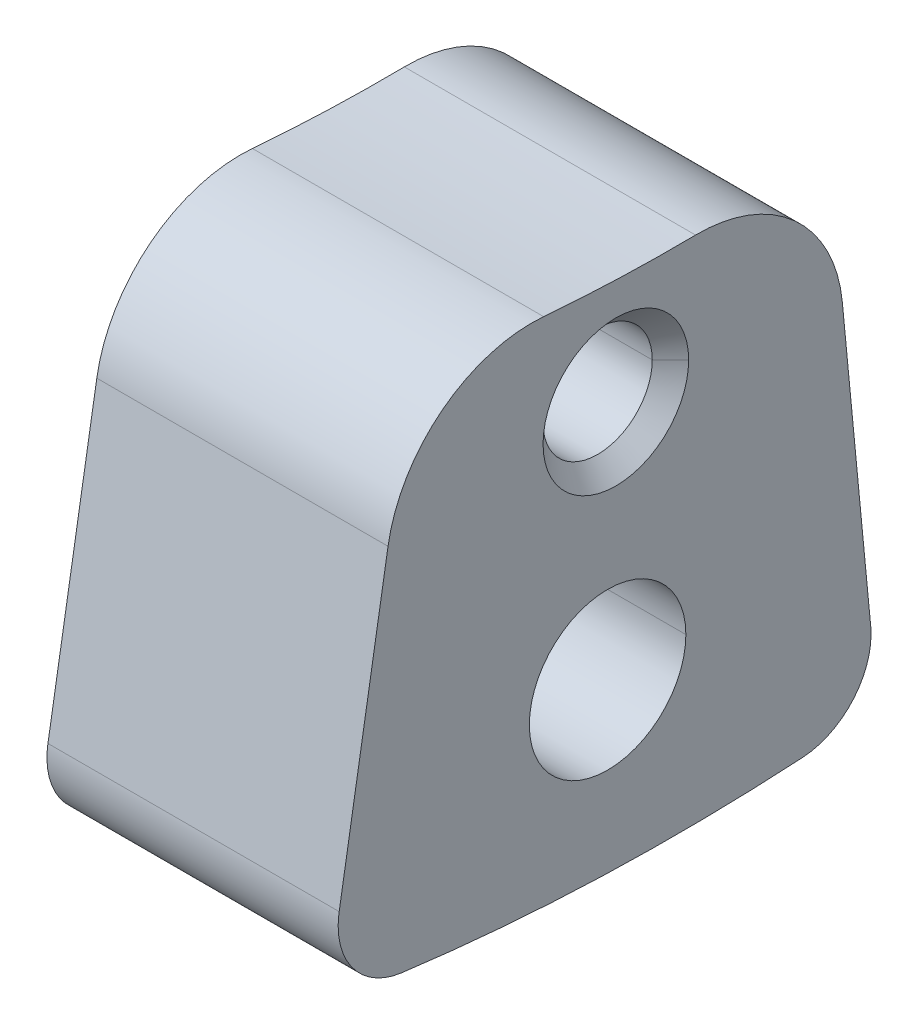
ISO-10303-21;
HEADER;
FILE_DESCRIPTION(('STEP AP214'),'2;1');
FILE_NAME('part.step','',(''),(''),'','','');
FILE_SCHEMA(('AUTOMOTIVE_DESIGN { 1 0 10303 214 1 1 1 1 }'));
ENDSEC;
DATA;
#1=APPLICATION_CONTEXT('core data for automotive mechanical design processes');
#2=APPLICATION_PROTOCOL_DEFINITION('international standard','automotive_design',2000,#1);
#3=PRODUCT_CONTEXT('',#1,'mechanical');
#4=PRODUCT('Part','Part','',(#3));
#5=PRODUCT_RELATED_PRODUCT_CATEGORY('part','',(#4));
#6=PRODUCT_DEFINITION_FORMATION('','',#4);
#7=PRODUCT_DEFINITION_CONTEXT('part definition',#1,'design');
#8=PRODUCT_DEFINITION('design','',#6,#7);
#9=PRODUCT_DEFINITION_SHAPE('','',#8);
#10=(LENGTH_UNIT() NAMED_UNIT(*) SI_UNIT(.MILLI.,.METRE.));
#11=(NAMED_UNIT(*) PLANE_ANGLE_UNIT() SI_UNIT($,.RADIAN.));
#12=(NAMED_UNIT(*) SI_UNIT($,.STERADIAN.) SOLID_ANGLE_UNIT());
#13=UNCERTAINTY_MEASURE_WITH_UNIT(LENGTH_MEASURE(1.E-05),#10,'distance_accuracy_value','');
#14=(GEOMETRIC_REPRESENTATION_CONTEXT(3) GLOBAL_UNCERTAINTY_ASSIGNED_CONTEXT((#13)) GLOBAL_UNIT_ASSIGNED_CONTEXT((#10,
#11,#12)) REPRESENTATION_CONTEXT('',''));
#15=CARTESIAN_POINT('',(0.,0.,0.));
#16=DIRECTION('',(0.,0.,1.));
#17=DIRECTION('',(1.,0.,0.));
#18=AXIS2_PLACEMENT_3D('',#15,#16,#17);
#19=CARTESIAN_POINT('',(55.1,0.,0.));
#20=DIRECTION('',(-1.,0.,0.));
#21=DIRECTION('',(0.,0.,1.));
#22=AXIS2_PLACEMENT_3D('',#19,#20,#21);
#23=PLANE('',#22);
#24=DIRECTION('',(0.,-1.,0.));
#25=VECTOR('',#24,1.);
#26=CARTESIAN_POINT('',(55.1,-46.6464746833,-60.56704418859));
#27=LINE('',#26,#25);
#28=CARTESIAN_POINT('',(55.1,-46.6464746833,-60.56704418859));
#29=VERTEX_POINT('',#28);
#30=CARTESIAN_POINT('',(55.1,-48.8464746833,-60.56704418859));
#31=VERTEX_POINT('',#30);
#32=EDGE_CURVE('E11',#29,#31,#27,.T.);
#33=ORIENTED_EDGE('',*,*,#32,.T.);
#34=DIRECTION('',(0.,0.,1.));
#35=VECTOR('',#34,1.);
#36=CARTESIAN_POINT('',(55.1,-48.8464746833,-60.56704418859));
#37=LINE('',#36,#35);
#38=CARTESIAN_POINT('',(55.1,-48.8464746833,-60.05640589199));
#39=VERTEX_POINT('',#38);
#40=EDGE_CURVE('E42',#31,#39,#37,.T.);
#41=ORIENTED_EDGE('',*,*,#40,.T.);
#42=DIRECTION('',(0.,1.,0.));
#43=VECTOR('',#42,1.);
#44=CARTESIAN_POINT('',(55.1,-48.8464746833,-60.05640589199));
#45=LINE('',#44,#43);
#46=CARTESIAN_POINT('',(55.1,-47.0964746833,-60.05640589199));
#47=VERTEX_POINT('',#46);
#48=EDGE_CURVE('E453',#39,#47,#45,.T.);
#49=ORIENTED_EDGE('',*,*,#48,.T.);
#50=DIRECTION('',(0.,0.,1.));
#51=VECTOR('',#50,1.);
#52=CARTESIAN_POINT('',(55.1,-47.0964746833,-60.05640589199));
#53=LINE('',#52,#51);
#54=CARTESIAN_POINT('',(55.1,-47.0964746833,-56.91704418859));
#55=VERTEX_POINT('',#54);
#56=EDGE_CURVE('E408',#47,#55,#53,.T.);
#57=ORIENTED_EDGE('',*,*,#56,.T.);
#58=DIRECTION('',(0.,1.,0.));
#59=VECTOR('',#58,1.);
#60=CARTESIAN_POINT('',(55.1,-47.0964746833,-56.91704418859));
#61=LINE('',#60,#59);
#62=CARTESIAN_POINT('',(55.1,-46.6464746833,-56.91704418859));
#63=VERTEX_POINT('',#62);
#64=EDGE_CURVE('E399',#55,#63,#61,.T.);
#65=ORIENTED_EDGE('',*,*,#64,.T.);
#66=DIRECTION('',(0.,0.,-1.));
#67=VECTOR('',#66,1.);
#68=CARTESIAN_POINT('',(55.1,-46.6464746833,-56.91704418859));
#69=LINE('',#68,#67);
#70=EDGE_CURVE('E278',#63,#29,#69,.T.);
#71=ORIENTED_EDGE('',*,*,#70,.T.);
#72=EDGE_LOOP('',(#33,#41,#49,#57,#65,#71));
#73=FACE_BOUND('',#72,.T.);
#74=ADVANCED_FACE('F17',(#73),#23,.T.);
#75=CARTESIAN_POINT('',(55.,-46.6464746833,-60.56704418859));
#76=DIRECTION('',(0.,0.,-1.));
#77=DIRECTION('',(0.,-1.,0.));
#78=AXIS2_PLACEMENT_3D('',#75,#76,#77);
#79=PLANE('',#78);
#80=DIRECTION('',(1.,0.,0.));
#81=VECTOR('',#80,1.);
#82=CARTESIAN_POINT('',(55.,-48.8464746833,-60.56704418859));
#83=LINE('',#82,#81);
#84=CARTESIAN_POINT('',(55.,-48.8464746833,-60.56704418859));
#85=VERTEX_POINT('',#84);
#86=EDGE_CURVE('E25',#85,#31,#83,.T.);
#87=ORIENTED_EDGE('',*,*,#86,.T.);
#88=ORIENTED_EDGE('',*,*,#32,.F.);
#89=DIRECTION('',(1.,0.,0.));
#90=VECTOR('',#89,1.);
#91=CARTESIAN_POINT('',(55.,-46.6464746833,-60.56704418859));
#92=LINE('',#91,#90);
#93=CARTESIAN_POINT('',(55.,-46.6464746833,-60.56704418859));
#94=VERTEX_POINT('',#93);
#95=EDGE_CURVE('E274',#94,#29,#92,.T.);
#96=ORIENTED_EDGE('',*,*,#95,.F.);
#97=DIRECTION('',(0.,-1.,0.));
#98=VECTOR('',#97,1.);
#99=CARTESIAN_POINT('',(55.,-46.6464746833,-60.56704418859));
#100=LINE('',#99,#98);
#101=EDGE_CURVE('E328',#94,#85,#100,.T.);
#102=ORIENTED_EDGE('',*,*,#101,.T.);
#103=EDGE_LOOP('',(#87,#88,#96,#102));
#104=FACE_BOUND('',#103,.T.);
#105=ADVANCED_FACE('F680',(#104),#79,.F.);
#106=CARTESIAN_POINT('',(55.,-48.8464746833,-60.56704418859));
#107=DIRECTION('',(0.,-1.,0.));
#108=DIRECTION('',(0.,0.,-1.));
#109=AXIS2_PLACEMENT_3D('',#106,#107,#108);
#110=PLANE('',#109);
#111=DIRECTION('',(1.,0.,0.));
#112=VECTOR('',#111,1.);
#113=CARTESIAN_POINT('',(55.,-48.8464746833,-60.05640589199));
#114=LINE('',#113,#112);
#115=CARTESIAN_POINT('',(55.,-48.8464746833,-60.05640589199));
#116=VERTEX_POINT('',#115);
#117=EDGE_CURVE('E479',#116,#39,#114,.T.);
#118=ORIENTED_EDGE('',*,*,#117,.T.);
#119=ORIENTED_EDGE('',*,*,#40,.F.);
#120=ORIENTED_EDGE('',*,*,#86,.F.);
#121=DIRECTION('',(0.,0.,1.));
#122=VECTOR('',#121,1.);
#123=CARTESIAN_POINT('',(55.,-48.8464746833,-60.56704418859));
#124=LINE('',#123,#122);
#125=EDGE_CURVE('E324',#85,#116,#124,.T.);
#126=ORIENTED_EDGE('',*,*,#125,.T.);
#127=EDGE_LOOP('',(#118,#119,#120,#126));
#128=FACE_BOUND('',#127,.T.);
#129=ADVANCED_FACE('F684',(#128),#110,.F.);
#130=CARTESIAN_POINT('',(55.,-49.3464746833,-60.05640589199));
#131=DIRECTION('',(0.,0.,1.));
#132=DIRECTION('',(1.,0.,0.));
#133=AXIS2_PLACEMENT_3D('',#130,#131,#132);
#134=PLANE('',#133);
#135=DIRECTION('',(1.,0.,0.));
#136=VECTOR('',#135,1.);
#137=CARTESIAN_POINT('',(55.,-47.0964746833,-60.05640589199));
#138=LINE('',#137,#136);
#139=CARTESIAN_POINT('',(55.,-47.0964746833,-60.05640589199));
#140=VERTEX_POINT('',#139);
#141=EDGE_CURVE('E411',#140,#47,#138,.T.);
#142=ORIENTED_EDGE('',*,*,#141,.T.);
#143=ORIENTED_EDGE('',*,*,#48,.F.);
#144=ORIENTED_EDGE('',*,*,#117,.F.);
#145=DIRECTION('',(0.,1.,0.));
#146=VECTOR('',#145,1.);
#147=CARTESIAN_POINT('',(55.,-48.8464746833,-60.05640589199));
#148=LINE('',#147,#146);
#149=EDGE_CURVE('E320',#116,#140,#148,.T.);
#150=ORIENTED_EDGE('',*,*,#149,.T.);
#151=EDGE_LOOP('',(#142,#143,#144,#150));
#152=FACE_BOUND('',#151,.T.);
#153=ADVANCED_FACE('F689',(#152),#134,.F.);
#154=CARTESIAN_POINT('',(55.,-47.0964746833,-60.05640589199));
#155=DIRECTION('',(0.,-1.,0.));
#156=DIRECTION('',(0.,0.,-1.));
#157=AXIS2_PLACEMENT_3D('',#154,#155,#156);
#158=PLANE('',#157);
#159=DIRECTION('',(1.,0.,0.));
#160=VECTOR('',#159,1.);
#161=CARTESIAN_POINT('',(55.,-47.0964746833,-56.91704418859));
#162=LINE('',#161,#160);
#163=CARTESIAN_POINT('',(55.,-47.0964746833,-56.91704418859));
#164=VERTEX_POINT('',#163);
#165=EDGE_CURVE('E412',#164,#55,#162,.T.);
#166=ORIENTED_EDGE('',*,*,#165,.T.);
#167=ORIENTED_EDGE('',*,*,#56,.F.);
#168=ORIENTED_EDGE('',*,*,#141,.F.);
#169=DIRECTION('',(0.,0.,1.));
#170=VECTOR('',#169,1.);
#171=CARTESIAN_POINT('',(55.,-47.0964746833,-60.05640589199));
#172=LINE('',#171,#170);
#173=EDGE_CURVE('E319',#140,#164,#172,.T.);
#174=ORIENTED_EDGE('',*,*,#173,.T.);
#175=EDGE_LOOP('',(#166,#167,#168,#174));
#176=FACE_BOUND('',#175,.T.);
#177=ADVANCED_FACE('F695',(#176),#158,.F.);
#178=CARTESIAN_POINT('',(55.,-47.0964746833,-56.91704418859));
#179=DIRECTION('',(0.,0.,1.));
#180=DIRECTION('',(1.,0.,0.));
#181=AXIS2_PLACEMENT_3D('',#178,#179,#180);
#182=PLANE('',#181);
#183=DIRECTION('',(1.,0.,0.));
#184=VECTOR('',#183,1.);
#185=CARTESIAN_POINT('',(55.,-46.6464746833,-56.91704418859));
#186=LINE('',#185,#184);
#187=CARTESIAN_POINT('',(55.,-46.6464746833,-56.91704418859));
#188=VERTEX_POINT('',#187);
#189=EDGE_CURVE('E395',#188,#63,#186,.T.);
#190=ORIENTED_EDGE('',*,*,#189,.T.);
#191=ORIENTED_EDGE('',*,*,#64,.F.);
#192=ORIENTED_EDGE('',*,*,#165,.F.);
#193=DIRECTION('',(0.,1.,0.));
#194=VECTOR('',#193,1.);
#195=CARTESIAN_POINT('',(55.,-47.0964746833,-56.91704418859));
#196=LINE('',#195,#194);
#197=EDGE_CURVE('E302',#164,#188,#196,.T.);
#198=ORIENTED_EDGE('',*,*,#197,.T.);
#199=EDGE_LOOP('',(#190,#191,#192,#198));
#200=FACE_BOUND('',#199,.T.);
#201=ADVANCED_FACE('F699',(#200),#182,.F.);
#202=CARTESIAN_POINT('',(55.,-46.6464746833,-56.56704418859));
#203=DIRECTION('',(0.,1.,0.));
#204=DIRECTION('',(1.,0.,0.));
#205=AXIS2_PLACEMENT_3D('',#202,#203,#204);
#206=PLANE('',#205);
#207=ORIENTED_EDGE('',*,*,#95,.T.);
#208=ORIENTED_EDGE('',*,*,#70,.F.);
#209=ORIENTED_EDGE('',*,*,#189,.F.);
#210=DIRECTION('',(0.,0.,-1.));
#211=VECTOR('',#210,1.);
#212=CARTESIAN_POINT('',(55.,-46.6464746833,-56.91704418859));
#213=LINE('',#212,#211);
#214=EDGE_CURVE('E332',#188,#94,#213,.T.);
#215=ORIENTED_EDGE('',*,*,#214,.T.);
#216=EDGE_LOOP('',(#207,#208,#209,#215));
#217=FACE_BOUND('',#216,.T.);
#218=ADVANCED_FACE('F703',(#217),#206,.F.);
#219=CARTESIAN_POINT('',(55.,-46.8714297872,-62.36321360465));
#220=DIRECTION('',(1.,0.,0.));
#221=DIRECTION('',(0.,0.,-1.));
#222=AXIS2_PLACEMENT_3D('',#219,#220,#221);
#223=CYLINDRICAL_SURFACE('',#222,1.5);
#224=DIRECTION('',(-1.,-1.333470815331E-10,6.144489362137E-11));
#225=VECTOR('',#224,1.);
#226=CARTESIAN_POINT('',(62.49999999954,-46.8714297862,-60.86321360511));
#227=LINE('',#226,#225);
#228=CARTESIAN_POINT('',(62.5,-46.8714297872,-60.86321360465));
#229=VERTEX_POINT('',#228);
#230=CARTESIAN_POINT('',(55.,-46.8714297872,-60.86321360465));
#231=VERTEX_POINT('',#230);
#232=EDGE_CURVE('E279',#229,#231,#227,.T.);
#233=ORIENTED_EDGE('',*,*,#232,.T.);
#234=CARTESIAN_POINT('',(55.,-46.8714297872,-62.36321360465));
#235=DIRECTION('',(-1.,0.,0.));
#236=DIRECTION('',(0.,0.,1.));
#237=AXIS2_PLACEMENT_3D('',#234,#235,#236);
#238=CIRCLE('',#237,1.5);
#239=CARTESIAN_POINT('',(55.,-46.8714297872,-63.86321360465));
#240=VERTEX_POINT('',#239);
#241=EDGE_CURVE('E298',#231,#240,#238,.T.);
#242=ORIENTED_EDGE('',*,*,#241,.T.);
#243=DIRECTION('',(-1.,1.333508710944E-10,-6.144394623105E-11));
#244=VECTOR('',#243,1.);
#245=CARTESIAN_POINT('',(62.49999999954,-46.8714297882,-63.86321360419));
#246=LINE('',#245,#244);
#247=CARTESIAN_POINT('',(62.5,-46.8714297872,-63.86321360465));
#248=VERTEX_POINT('',#247);
#249=EDGE_CURVE('E463',#248,#240,#246,.T.);
#250=ORIENTED_EDGE('',*,*,#249,.F.);
#251=CARTESIAN_POINT('',(62.5,-46.8714297872,-62.36321360465));
#252=DIRECTION('',(-1.,0.,0.));
#253=DIRECTION('',(0.,0.,1.));
#254=AXIS2_PLACEMENT_3D('',#251,#252,#253);
#255=CIRCLE('',#254,1.5);
#256=EDGE_CURVE('E351',#229,#248,#255,.T.);
#257=ORIENTED_EDGE('',*,*,#256,.F.);
#258=EDGE_LOOP('',(#233,#242,#250,#257));
#259=FACE_BOUND('',#258,.T.);
#260=ADVANCED_FACE('F707',(#259),#223,.F.);
#261=CARTESIAN_POINT('',(55.,-46.8714297872,-62.36321360465));
#262=DIRECTION('',(1.,0.,0.));
#263=DIRECTION('',(0.,0.,-1.));
#264=AXIS2_PLACEMENT_3D('',#261,#262,#263);
#265=CYLINDRICAL_SURFACE('',#264,1.5);
#266=ORIENTED_EDGE('',*,*,#249,.T.);
#267=CARTESIAN_POINT('',(55.,-46.8714297872,-62.36321360465));
#268=DIRECTION('',(-1.,0.,0.));
#269=DIRECTION('',(0.,0.,-1.));
#270=AXIS2_PLACEMENT_3D('',#267,#268,#269);
#271=CIRCLE('',#270,1.5);
#272=EDGE_CURVE('E303',#240,#231,#271,.T.);
#273=ORIENTED_EDGE('',*,*,#272,.T.);
#274=ORIENTED_EDGE('',*,*,#232,.F.);
#275=CARTESIAN_POINT('',(62.5,-46.8714297872,-62.36321360465));
#276=DIRECTION('',(-1.,0.,0.));
#277=DIRECTION('',(0.,0.,-1.));
#278=AXIS2_PLACEMENT_3D('',#275,#276,#277);
#279=CIRCLE('',#278,1.5);
#280=EDGE_CURVE('E350',#248,#229,#279,.T.);
#281=ORIENTED_EDGE('',*,*,#280,.F.);
#282=EDGE_LOOP('',(#266,#273,#274,#281));
#283=FACE_BOUND('',#282,.T.);
#284=ADVANCED_FACE('F711',(#283),#265,.F.);
#285=CARTESIAN_POINT('',(62.74999999951,-46.8714297872,-62.36321360465));
#286=DIRECTION('',(1.,0.,0.));
#287=DIRECTION('',(0.,0.,-1.));
#288=AXIS2_PLACEMENT_3D('',#285,#286,#287);
#289=CONICAL_SURFACE('',#288,1.749999999507,0.7853981633973);
#290=DIRECTION('',(-0.707106781186548,1.10005953244907E-09,0.707106781186548));
#291=VECTOR('',#290,1.);
#292=CARTESIAN_POINT('',(62.99999999918,-46.87142978898,-64.36321360383));
#293=LINE('',#292,#291);
#294=CARTESIAN_POINT('',(63.,-46.8714297872,-64.36321360465));
#295=VERTEX_POINT('',#294);
#296=EDGE_CURVE('E346',#295,#248,#293,.T.);
#297=ORIENTED_EDGE('',*,*,#296,.T.);
#298=ORIENTED_EDGE('',*,*,#280,.T.);
#299=DIRECTION('',(-0.707106781186498,-1.100069581041E-09,-0.707106781186597));
#300=VECTOR('',#299,1.);
#301=CARTESIAN_POINT('',(62.99999999918,-46.87142978542,-60.36321360547));
#302=LINE('',#301,#300);
#303=CARTESIAN_POINT('',(63.,-46.8714297872,-60.36321360465));
#304=VERTEX_POINT('',#303);
#305=EDGE_CURVE('E449',#304,#229,#302,.T.);
#306=ORIENTED_EDGE('',*,*,#305,.F.);
#307=CARTESIAN_POINT('',(63.,-46.8714297872,-62.36321360465));
#308=DIRECTION('',(-1.,0.,0.));
#309=DIRECTION('',(0.,0.,-1.));
#310=AXIS2_PLACEMENT_3D('',#307,#308,#309);
#311=CIRCLE('',#310,2.);
#312=EDGE_CURVE('E383',#295,#304,#311,.T.);
#313=ORIENTED_EDGE('',*,*,#312,.F.);
#314=EDGE_LOOP('',(#297,#298,#306,#313));
#315=FACE_BOUND('',#314,.T.);
#316=ADVANCED_FACE('F715',(#315),#289,.F.);
#317=CARTESIAN_POINT('',(62.74999999951,-46.8714297872,-62.36321360465));
#318=DIRECTION('',(1.,0.,0.));
#319=DIRECTION('',(0.,0.,-1.));
#320=AXIS2_PLACEMENT_3D('',#317,#318,#319);
#321=CONICAL_SURFACE('',#320,1.749999999507,0.7853981633973);
#322=ORIENTED_EDGE('',*,*,#305,.T.);
#323=ORIENTED_EDGE('',*,*,#256,.T.);
#324=ORIENTED_EDGE('',*,*,#296,.F.);
#325=CARTESIAN_POINT('',(63.,-46.8714297872,-62.36321360465));
#326=DIRECTION('',(-1.,0.,0.));
#327=DIRECTION('',(0.,0.,1.));
#328=AXIS2_PLACEMENT_3D('',#325,#326,#327);
#329=CIRCLE('',#328,2.);
#330=EDGE_CURVE('E394',#304,#295,#329,.T.);
#331=ORIENTED_EDGE('',*,*,#330,.F.);
#332=EDGE_LOOP('',(#322,#323,#324,#331));
#333=FACE_BOUND('',#332,.T.);
#334=ADVANCED_FACE('F719',(#333),#321,.F.);
#335=CARTESIAN_POINT('',(55.,-53.36747016282,-62.13636687609));
#336=DIRECTION('',(1.,0.,0.));
#337=DIRECTION('',(0.,0.,-1.));
#338=AXIS2_PLACEMENT_3D('',#335,#336,#337);
#339=CYLINDRICAL_SURFACE('',#338,2.15);
#340=DIRECTION('',(-1.,2.037552349241E-10,8.587010468503E-11));
#341=VECTOR('',#340,1.);
#342=CARTESIAN_POINT('',(63.,-53.36747016282,-64.28636687609));
#343=LINE('',#342,#341);
#344=CARTESIAN_POINT('',(63.,-53.36747016282,-64.28636687609));
#345=VERTEX_POINT('',#344);
#346=CARTESIAN_POINT('',(59.5,-53.36747016282,-64.28636687609));
#347=VERTEX_POINT('',#346);
#348=EDGE_CURVE('E284',#345,#347,#343,.T.);
#349=ORIENTED_EDGE('',*,*,#348,.F.);
#350=CARTESIAN_POINT('',(63.,-53.36747016282,-62.13636687609));
#351=DIRECTION('',(1.,0.,0.));
#352=DIRECTION('',(0.,0.,-1.));
#353=AXIS2_PLACEMENT_3D('',#350,#351,#352);
#354=CIRCLE('',#353,2.15);
#355=CARTESIAN_POINT('',(63.,-53.36747016282,-59.98636687609));
#356=VERTEX_POINT('',#355);
#357=EDGE_CURVE('E384',#345,#356,#354,.T.);
#358=ORIENTED_EDGE('',*,*,#357,.T.);
#359=DIRECTION('',(-1.,-2.037592951683E-10,-8.586807456293E-11));
#360=VECTOR('',#359,1.);
#361=CARTESIAN_POINT('',(63.,-53.36747016282,-59.98636687609));
#362=LINE('',#361,#360);
#363=CARTESIAN_POINT('',(59.5,-53.36747016282,-59.98636687609));
#364=VERTEX_POINT('',#363);
#365=EDGE_CURVE('E280',#356,#364,#362,.T.);
#366=ORIENTED_EDGE('',*,*,#365,.T.);
#367=CARTESIAN_POINT('',(59.5,-53.36747016282,-62.13636687609));
#368=DIRECTION('',(1.,0.,0.));
#369=DIRECTION('',(0.,0.,-1.));
#370=AXIS2_PLACEMENT_3D('',#367,#368,#369);
#371=CIRCLE('',#370,2.15);
#372=EDGE_CURVE('E446',#347,#364,#371,.T.);
#373=ORIENTED_EDGE('',*,*,#372,.F.);
#374=EDGE_LOOP('',(#349,#358,#366,#373));
#375=FACE_BOUND('',#374,.T.);
#376=ADVANCED_FACE('F723',(#375),#339,.F.);
#377=CARTESIAN_POINT('',(59.25000000038,-53.36747016282,-62.13636687609));
#378=DIRECTION('',(-1.,0.,0.));
#379=DIRECTION('',(0.,0.,-1.));
#380=AXIS2_PLACEMENT_3D('',#377,#378,#379);
#381=CONICAL_SURFACE('',#380,2.399999999621,0.7853981633973);
#382=DIRECTION('',(0.707106781186597,-6.48897860167498E-10,0.707106781186498));
#383=VECTOR('',#382,1.);
#384=CARTESIAN_POINT('',(59.00000000049,-53.36747016165,-64.7863668756));
#385=LINE('',#384,#383);
#386=CARTESIAN_POINT('',(59.,-53.36747016282,-64.78636687609));
#387=VERTEX_POINT('',#386);
#388=EDGE_CURVE('E426',#387,#347,#385,.T.);
#389=ORIENTED_EDGE('',*,*,#388,.T.);
#390=ORIENTED_EDGE('',*,*,#372,.T.);
#391=DIRECTION('',(0.707106781186548,6.48917957351044E-10,-0.707106781186548));
#392=VECTOR('',#391,1.);
#393=CARTESIAN_POINT('',(59.00000000049,-53.36747016399,-59.48636687658));
#394=LINE('',#393,#392);
#395=CARTESIAN_POINT('',(59.,-53.36747016282,-59.48636687609));
#396=VERTEX_POINT('',#395);
#397=EDGE_CURVE('E422',#396,#364,#394,.T.);
#398=ORIENTED_EDGE('',*,*,#397,.F.);
#399=CARTESIAN_POINT('',(59.,-53.36747016282,-62.13636687609));
#400=DIRECTION('',(1.,0.,0.));
#401=DIRECTION('',(0.,0.,-1.));
#402=AXIS2_PLACEMENT_3D('',#399,#400,#401);
#403=CIRCLE('',#402,2.65);
#404=EDGE_CURVE('E315',#387,#396,#403,.T.);
#405=ORIENTED_EDGE('',*,*,#404,.F.);
#406=EDGE_LOOP('',(#389,#390,#398,#405));
#407=FACE_BOUND('',#406,.T.);
#408=ADVANCED_FACE('F727',(#407),#381,.F.);
#409=CARTESIAN_POINT('',(55.,-53.36747016282,-62.13636687609));
#410=DIRECTION('',(1.,0.,0.));
#411=DIRECTION('',(0.,0.,-1.));
#412=AXIS2_PLACEMENT_3D('',#409,#410,#411);
#413=CYLINDRICAL_SURFACE('',#412,4.125);
#414=DIRECTION('',(-1.,0.,0.));
#415=VECTOR('',#414,1.);
#416=CARTESIAN_POINT('',(59.,-53.36747016282,-58.01136687609));
#417=LINE('',#416,#415);
#418=CARTESIAN_POINT('',(59.,-53.36747016282,-58.01136687609));
#419=VERTEX_POINT('',#418);
#420=CARTESIAN_POINT('',(55.,-53.36747016282,-58.01136687609));
#421=VERTEX_POINT('',#420);
#422=EDGE_CURVE('E314',#419,#421,#417,.T.);
#423=ORIENTED_EDGE('',*,*,#422,.T.);
#424=CARTESIAN_POINT('',(55.,-53.36747016282,-62.13636687609));
#425=DIRECTION('',(-1.,0.,0.));
#426=DIRECTION('',(0.,0.,1.));
#427=AXIS2_PLACEMENT_3D('',#424,#425,#426);
#428=CIRCLE('',#427,4.125);
#429=CARTESIAN_POINT('',(55.,-53.36747016282,-66.26136687609));
#430=VERTEX_POINT('',#429);
#431=EDGE_CURVE('E307',#421,#430,#428,.T.);
#432=ORIENTED_EDGE('',*,*,#431,.T.);
#433=DIRECTION('',(-1.,0.,0.));
#434=VECTOR('',#433,1.);
#435=CARTESIAN_POINT('',(59.,-53.36747016282,-66.26136687609));
#436=LINE('',#435,#434);
#437=CARTESIAN_POINT('',(59.,-53.36747016282,-66.26136687609));
#438=VERTEX_POINT('',#437);
#439=EDGE_CURVE('E311',#438,#430,#436,.T.);
#440=ORIENTED_EDGE('',*,*,#439,.F.);
#441=CARTESIAN_POINT('',(59.,-53.36747016282,-62.13636687609));
#442=DIRECTION('',(1.,0.,0.));
#443=DIRECTION('',(0.,0.,-1.));
#444=AXIS2_PLACEMENT_3D('',#441,#442,#443);
#445=CIRCLE('',#444,4.125);
#446=EDGE_CURVE('E434',#438,#419,#445,.T.);
#447=ORIENTED_EDGE('',*,*,#446,.T.);
#448=EDGE_LOOP('',(#423,#432,#440,#447));
#449=FACE_BOUND('',#448,.T.);
#450=ADVANCED_FACE('F731',(#449),#413,.F.);
#451=CARTESIAN_POINT('',(55.,-53.36747016282,-62.13636687609));
#452=DIRECTION('',(1.,0.,0.));
#453=DIRECTION('',(0.,0.,-1.));
#454=AXIS2_PLACEMENT_3D('',#451,#452,#453);
#455=CYLINDRICAL_SURFACE('',#454,4.125);
#456=ORIENTED_EDGE('',*,*,#439,.T.);
#457=CARTESIAN_POINT('',(55.,-53.36747016282,-62.13636687609));
#458=DIRECTION('',(-1.,0.,0.));
#459=DIRECTION('',(0.,0.,-1.));
#460=AXIS2_PLACEMENT_3D('',#457,#458,#459);
#461=CIRCLE('',#460,4.125);
#462=EDGE_CURVE('E297',#430,#421,#461,.T.);
#463=ORIENTED_EDGE('',*,*,#462,.T.);
#464=ORIENTED_EDGE('',*,*,#422,.F.);
#465=CARTESIAN_POINT('',(59.,-53.36747016282,-62.13636687609));
#466=DIRECTION('',(1.,0.,0.));
#467=DIRECTION('',(0.,0.,1.));
#468=AXIS2_PLACEMENT_3D('',#465,#466,#467);
#469=CIRCLE('',#468,4.125);
#470=EDGE_CURVE('E438',#419,#438,#469,.T.);
#471=ORIENTED_EDGE('',*,*,#470,.T.);
#472=EDGE_LOOP('',(#456,#463,#464,#471));
#473=FACE_BOUND('',#472,.T.);
#474=ADVANCED_FACE('F737',(#473),#455,.F.);
#475=CARTESIAN_POINT('',(59.,-49.24247016282,-62.13636687609));
#476=DIRECTION('',(-1.,0.,0.));
#477=DIRECTION('',(0.,0.,1.));
#478=AXIS2_PLACEMENT_3D('',#475,#476,#477);
#479=PLANE('',#478);
#480=ORIENTED_EDGE('',*,*,#404,.T.);
#481=CARTESIAN_POINT('',(59.,-53.36747016282,-62.13636687609));
#482=DIRECTION('',(1.,0.,0.));
#483=DIRECTION('',(0.,0.,1.));
#484=AXIS2_PLACEMENT_3D('',#481,#482,#483);
#485=CIRCLE('',#484,2.65);
#486=EDGE_CURVE('E430',#396,#387,#485,.T.);
#487=ORIENTED_EDGE('',*,*,#486,.T.);
#488=EDGE_LOOP('',(#480,#487));
#489=FACE_BOUND('',#488,.T.);
#490=ORIENTED_EDGE('',*,*,#446,.F.);
#491=ORIENTED_EDGE('',*,*,#470,.F.);
#492=EDGE_LOOP('',(#490,#491));
#493=FACE_BOUND('',#492,.T.);
#494=ADVANCED_FACE('F733',(#489,#493),#479,.T.);
#495=CARTESIAN_POINT('',(59.25000000038,-53.36747016282,-62.13636687609));
#496=DIRECTION('',(-1.,0.,0.));
#497=DIRECTION('',(0.,0.,-1.));
#498=AXIS2_PLACEMENT_3D('',#495,#496,#497);
#499=CONICAL_SURFACE('',#498,2.399999999621,0.7853981633973);
#500=ORIENTED_EDGE('',*,*,#397,.T.);
#501=CARTESIAN_POINT('',(59.5,-53.36747016282,-62.13636687609));
#502=DIRECTION('',(1.,0.,0.));
#503=DIRECTION('',(0.,0.,1.));
#504=AXIS2_PLACEMENT_3D('',#501,#502,#503);
#505=CIRCLE('',#504,2.15);
#506=EDGE_CURVE('E418',#364,#347,#505,.T.);
#507=ORIENTED_EDGE('',*,*,#506,.T.);
#508=ORIENTED_EDGE('',*,*,#388,.F.);
#509=ORIENTED_EDGE('',*,*,#486,.F.);
#510=EDGE_LOOP('',(#500,#507,#508,#509));
#511=FACE_BOUND('',#510,.T.);
#512=ADVANCED_FACE('F736',(#511),#499,.F.);
#513=CARTESIAN_POINT('',(55.,-53.36747016282,-62.13636687609));
#514=DIRECTION('',(1.,0.,0.));
#515=DIRECTION('',(0.,0.,-1.));
#516=AXIS2_PLACEMENT_3D('',#513,#514,#515);
#517=CYLINDRICAL_SURFACE('',#516,2.15);
#518=ORIENTED_EDGE('',*,*,#365,.F.);
#519=CARTESIAN_POINT('',(63.,-53.36747016282,-62.13636687609));
#520=DIRECTION('',(1.,0.,0.));
#521=DIRECTION('',(0.,0.,1.));
#522=AXIS2_PLACEMENT_3D('',#519,#520,#521);
#523=CIRCLE('',#522,2.15);
#524=EDGE_CURVE('E379',#356,#345,#523,.T.);
#525=ORIENTED_EDGE('',*,*,#524,.T.);
#526=ORIENTED_EDGE('',*,*,#348,.T.);
#527=ORIENTED_EDGE('',*,*,#506,.F.);
#528=EDGE_LOOP('',(#518,#525,#526,#527));
#529=FACE_BOUND('',#528,.T.);
#530=ADVANCED_FACE('F744',(#529),#517,.F.);
#531=CARTESIAN_POINT('',(-1057.368264902,-47.99621214115,-64.60300920555));
#532=DIRECTION('',(1.,0.,0.));
#533=DIRECTION('',(0.,0.,-1.));
#534=AXIS2_PLACEMENT_3D('',#531,#532,#533);
#535=CYLINDRICAL_SURFACE('',#534,4.);
#536=DIRECTION('',(-1.,0.,3.517186542012E-13));
#537=VECTOR('',#536,1.);
#538=CARTESIAN_POINT('',(63.,-43.99652779605,-64.5527584384));
#539=LINE('',#538,#537);
#540=CARTESIAN_POINT('',(63.,-43.99652779605,-64.55275843837));
#541=VERTEX_POINT('',#540);
#542=CARTESIAN_POINT('',(55.,-43.99652779605,-64.55275843836));
#543=VERTEX_POINT('',#542);
#544=EDGE_CURVE('E339',#541,#543,#539,.T.);
#545=ORIENTED_EDGE('',*,*,#544,.F.);
#546=CARTESIAN_POINT('',(63.,-47.99621214115,-64.60300920555));
#547=DIRECTION('',(-1.,0.,0.));
#548=DIRECTION('',(0.,0.99992108627374,0.0125626917953105));
#549=AXIS2_PLACEMENT_3D('',#546,#547,#548);
#550=CIRCLE('',#549,4.);
#551=CARTESIAN_POINT('',(63.,-47.61282913109,-68.58459399902));
#552=VERTEX_POINT('',#551);
#553=EDGE_CURVE('E352',#541,#552,#550,.T.);
#554=ORIENTED_EDGE('',*,*,#553,.T.);
#555=DIRECTION('',(1.,-2.343014671169E-12,-4.032330025439E-13));
#556=VECTOR('',#555,1.);
#557=CARTESIAN_POINT('',(55.,-47.61282913108,-68.58459399902));
#558=LINE('',#557,#556);
#559=CARTESIAN_POINT('',(55.,-47.61282913108,-68.58459399902));
#560=VERTEX_POINT('',#559);
#561=EDGE_CURVE('E403',#560,#552,#558,.T.);
#562=ORIENTED_EDGE('',*,*,#561,.F.);
#563=CARTESIAN_POINT('',(55.,-47.99621214115,-64.60300920555));
#564=DIRECTION('',(1.,0.,0.));
#565=DIRECTION('',(0.,0.0958457525159788,-0.995396198367588));
#566=AXIS2_PLACEMENT_3D('',#563,#564,#565);
#567=CIRCLE('',#566,4.);
#568=EDGE_CURVE('E633',#560,#543,#567,.T.);
#569=ORIENTED_EDGE('',*,*,#568,.T.);
#570=EDGE_LOOP('',(#545,#554,#562,#569));
#571=FACE_BOUND('',#570,.T.);
#572=ADVANCED_FACE('F650',(#571),#535,.T.);
#573=CARTESIAN_POINT('',(-1057.368264902,-47.83723198484,-60.05041318252));
#574=DIRECTION('',(1.,0.,0.));
#575=DIRECTION('',(0.,0.,-1.));
#576=AXIS2_PLACEMENT_3D('',#573,#574,#575);
#577=CYLINDRICAL_SURFACE('',#576,4.);
#578=DIRECTION('',(-1.,3.983480212355E-12,-9.672262990534E-13));
#579=VECTOR('',#578,1.);
#580=CARTESIAN_POINT('',(63.,-47.1770415614,-56.10527077637));
#581=LINE('',#580,#579);
#582=CARTESIAN_POINT('',(63.,-47.1770415614,-56.10527077637));
#583=VERTEX_POINT('',#582);
#584=CARTESIAN_POINT('',(55.,-47.17704156131,-56.10527077639));
#585=VERTEX_POINT('',#584);
#586=EDGE_CURVE('E285',#583,#585,#581,.T.);
#587=ORIENTED_EDGE('',*,*,#586,.F.);
#588=CARTESIAN_POINT('',(63.,-47.83723198484,-60.05041318252));
#589=DIRECTION('',(-1.,0.,0.));
#590=DIRECTION('',(0.,0.165047605857899,0.986285601537696));
#591=AXIS2_PLACEMENT_3D('',#588,#589,#590);
#592=CIRCLE('',#591,4.);
#593=CARTESIAN_POINT('',(63.,-43.85079598611,-60.37954541736));
#594=VERTEX_POINT('',#593);
#595=EDGE_CURVE('E356',#583,#594,#592,.T.);
#596=ORIENTED_EDGE('',*,*,#595,.T.);
#597=DIRECTION('',(1.,0.,1.545430450278E-13));
#598=VECTOR('',#597,1.);
#599=CARTESIAN_POINT('',(55.,-43.8507959861,-60.37954541733));
#600=LINE('',#599,#598);
#601=CARTESIAN_POINT('',(55.,-43.85079598611,-60.37954541736));
#602=VERTEX_POINT('',#601);
#603=EDGE_CURVE('E342',#602,#594,#600,.T.);
#604=ORIENTED_EDGE('',*,*,#603,.F.);
#605=CARTESIAN_POINT('',(55.,-47.83723198484,-60.05041318252));
#606=DIRECTION('',(1.,0.,0.));
#607=DIRECTION('',(0.,0.996608999683,-0.08228305871107));
#608=AXIS2_PLACEMENT_3D('',#605,#606,#607);
#609=CIRCLE('',#608,4.);
#610=EDGE_CURVE('E289',#602,#585,#609,.T.);
#611=ORIENTED_EDGE('',*,*,#610,.T.);
#612=EDGE_LOOP('',(#587,#596,#604,#611));
#613=FACE_BOUND('',#612,.T.);
#614=ADVANCED_FACE('F659',(#613),#577,.T.);
#615=CARTESIAN_POINT('',(-1057.368264902,-54.73885088532,-54.83985787473));
#616=DIRECTION('',(0.,0.165047605860704,0.986285601537227));
#617=DIRECTION('',(1.,0.,0.));
#618=AXIS2_PLACEMENT_3D('',#615,#616,#617);
#619=PLANE('',#618);
#620=ORIENTED_EDGE('',*,*,#586,.T.);
#621=DIRECTION('',(0.,-0.986285601537243,0.165047605860607));
#622=VECTOR('',#621,1.);
#623=CARTESIAN_POINT('',(55.,-47.17704156137,-56.10527077638));
#624=LINE('',#623,#622);
#625=CARTESIAN_POINT('',(55.,-55.1967579609,-54.76323050999));
#626=VERTEX_POINT('',#625);
#627=EDGE_CURVE('E271',#585,#626,#624,.T.);
#628=ORIENTED_EDGE('',*,*,#627,.T.);
#629=DIRECTION('',(1.,1.082778311456E-11,-1.50990331349E-12));
#630=VECTOR('',#629,1.);
#631=CARTESIAN_POINT('',(55.,-55.1967579609,-54.76323050999));
#632=LINE('',#631,#630);
#633=CARTESIAN_POINT('',(63.,-55.19675796076,-54.76323051001));
#634=VERTEX_POINT('',#633);
#635=EDGE_CURVE('E333',#626,#634,#632,.T.);
#636=ORIENTED_EDGE('',*,*,#635,.T.);
#637=DIRECTION('',(0.,0.986285601537243,-0.165047605860607));
#638=VECTOR('',#637,1.);
#639=CARTESIAN_POINT('',(63.,-55.19675796082,-54.76323051));
#640=LINE('',#639,#638);
#641=EDGE_CURVE('E359',#634,#583,#640,.T.);
#642=ORIENTED_EDGE('',*,*,#641,.T.);
#643=EDGE_LOOP('',(#620,#628,#636,#642));
#644=FACE_BOUND('',#643,.T.);
#645=ADVANCED_FACE('F665',(#644),#619,.T.);
#646=CARTESIAN_POINT('',(-1057.368264902,-55.52685317257,-56.73580171307));
#647=DIRECTION('',(1.,0.,0.));
#648=DIRECTION('',(0.,0.,-1.));
#649=AXIS2_PLACEMENT_3D('',#646,#647,#648);
#650=CYLINDRICAL_SURFACE('',#649,2.);
#651=CARTESIAN_POINT('',(55.,-55.52685317257,-56.73580171307));
#652=DIRECTION('',(1.,0.,0.));
#653=DIRECTION('',(0.,0.,1.));
#654=AXIS2_PLACEMENT_3D('',#651,#652,#653);
#655=CIRCLE('',#654,2.);
#656=CARTESIAN_POINT('',(55.,-55.52685317257,-54.73580171307));
#657=VERTEX_POINT('',#656);
#658=CARTESIAN_POINT('',(55.,-57.50995507159,-56.47636605996));
#659=VERTEX_POINT('',#658);
#660=EDGE_CURVE('E251',#657,#659,#655,.T.);
#661=ORIENTED_EDGE('',*,*,#660,.T.);
#662=DIRECTION('',(-1.,0.,0.));
#663=VECTOR('',#662,1.);
#664=CARTESIAN_POINT('',(63.,-57.50995507159,-56.47636605997));
#665=LINE('',#664,#663);
#666=CARTESIAN_POINT('',(63.,-57.50995507159,-56.47636605996));
#667=VERTEX_POINT('',#666);
#668=EDGE_CURVE('E241',#667,#659,#665,.T.);
#669=ORIENTED_EDGE('',*,*,#668,.F.);
#670=CARTESIAN_POINT('',(63.,-55.52685317257,-56.73580171307));
#671=DIRECTION('',(-1.,0.,0.));
#672=DIRECTION('',(0.,-0.991550949509871,0.129717826554696));
#673=AXIS2_PLACEMENT_3D('',#670,#671,#672);
#674=CIRCLE('',#673,2.);
#675=CARTESIAN_POINT('',(63.,-55.52685317257,-54.73580171307));
#676=VERTEX_POINT('',#675);
#677=EDGE_CURVE('E367',#667,#676,#674,.T.);
#678=ORIENTED_EDGE('',*,*,#677,.T.);
#679=CARTESIAN_POINT('',(63.,-55.52685317257,-56.73580171307));
#680=DIRECTION('',(-1.,0.,0.));
#681=DIRECTION('',(0.,0.,1.));
#682=AXIS2_PLACEMENT_3D('',#679,#680,#681);
#683=CIRCLE('',#682,2.);
#684=EDGE_CURVE('E363',#676,#634,#683,.T.);
#685=ORIENTED_EDGE('',*,*,#684,.T.);
#686=ORIENTED_EDGE('',*,*,#635,.F.);
#687=CARTESIAN_POINT('',(55.,-55.52685317257,-56.73580171307));
#688=DIRECTION('',(1.,0.,0.));
#689=DIRECTION('',(0.,0.165047605777897,0.986285601551084));
#690=AXIS2_PLACEMENT_3D('',#687,#688,#689);
#691=CIRCLE('',#690,2.);
#692=EDGE_CURVE('E268',#626,#657,#691,.T.);
#693=ORIENTED_EDGE('',*,*,#692,.T.);
#694=EDGE_LOOP('',(#661,#669,#678,#685,#686,#693));
#695=FACE_BOUND('',#694,.T.);
#696=ADVANCED_FACE('F668',(#695),#650,.T.);
#697=CARTESIAN_POINT('',(-1057.368264902,2.463307335887E-13,-64.));
#698=DIRECTION('',(1.,0.,0.));
#699=DIRECTION('',(0.,0.,-1.));
#700=AXIS2_PLACEMENT_3D('',#697,#698,#699);
#701=CYLINDRICAL_SURFACE('',#700,58.);
#702=DIRECTION('',(1.,0.,1.971756091734E-13));
#703=VECTOR('',#702,1.);
#704=CARTESIAN_POINT('',(55.,-57.89468588488,-67.49361507493));
#705=LINE('',#704,#703);
#706=CARTESIAN_POINT('',(55.,-57.89468588487,-67.49361507495));
#707=VERTEX_POINT('',#706);
#708=CARTESIAN_POINT('',(63.,-57.89468588488,-67.49361507495));
#709=VERTEX_POINT('',#708);
#710=EDGE_CURVE('E228',#707,#709,#705,.T.);
#711=ORIENTED_EDGE('',*,*,#710,.T.);
#712=CARTESIAN_POINT('',(63.,2.463307335887E-13,-64.));
#713=DIRECTION('',(-1.,0.,0.));
#714=DIRECTION('',(0.,-0.998184239394359,-0.0602347426715275));
#715=AXIS2_PLACEMENT_3D('',#712,#713,#714);
#716=CIRCLE('',#715,58.);
#717=EDGE_CURVE('E370',#709,#667,#716,.T.);
#718=ORIENTED_EDGE('',*,*,#717,.T.);
#719=ORIENTED_EDGE('',*,*,#668,.T.);
#720=CARTESIAN_POINT('',(55.,2.463307335887E-13,-64.));
#721=DIRECTION('',(1.,0.,0.));
#722=DIRECTION('',(0.,-0.991550949510171,0.129717826552396));
#723=AXIS2_PLACEMENT_3D('',#720,#721,#722);
#724=CIRCLE('',#723,58.);
#725=EDGE_CURVE('E245',#659,#707,#724,.T.);
#726=ORIENTED_EDGE('',*,*,#725,.T.);
#727=EDGE_LOOP('',(#711,#718,#719,#726));
#728=FACE_BOUND('',#727,.T.);
#729=ADVANCED_FACE('F246',(#728),#701,.T.);
#730=CARTESIAN_POINT('',(-1057.368264902,-55.89831740609,-67.37314558957));
#731=DIRECTION('',(1.,0.,0.));
#732=DIRECTION('',(0.,0.,-1.));
#733=AXIS2_PLACEMENT_3D('',#730,#731,#732);
#734=CYLINDRICAL_SURFACE('',#733,2.);
#735=DIRECTION('',(-1.,-1.10187414748E-11,-8.828493491819E-13));
#736=VECTOR('',#735,1.);
#737=CARTESIAN_POINT('',(63.,-55.70662590093,-69.3639379863));
#738=LINE('',#737,#736);
#739=CARTESIAN_POINT('',(63.,-55.70662590093,-69.3639379863));
#740=VERTEX_POINT('',#739);
#741=CARTESIAN_POINT('',(55.,-55.70662590097,-69.3639379863));
#742=VERTEX_POINT('',#741);
#743=EDGE_CURVE('E242',#740,#742,#738,.T.);
#744=ORIENTED_EDGE('',*,*,#743,.F.);
#745=CARTESIAN_POINT('',(63.,-55.89831740609,-67.37314558957));
#746=DIRECTION('',(-1.,0.,0.));
#747=DIRECTION('',(0.,0.0958457526933607,-0.995396198350508));
#748=AXIS2_PLACEMENT_3D('',#745,#746,#747);
#749=CIRCLE('',#748,2.);
#750=CARTESIAN_POINT('',(63.,-55.89831740609,-69.37314558957));
#751=VERTEX_POINT('',#750);
#752=EDGE_CURVE('E375',#740,#751,#749,.T.);
#753=ORIENTED_EDGE('',*,*,#752,.T.);
#754=CARTESIAN_POINT('',(63.,-55.89831740609,-67.37314558957));
#755=DIRECTION('',(-1.,0.,0.));
#756=DIRECTION('',(0.,0.,-1.));
#757=AXIS2_PLACEMENT_3D('',#754,#755,#756);
#758=CIRCLE('',#757,2.);
#759=EDGE_CURVE('E236',#751,#709,#758,.T.);
#760=ORIENTED_EDGE('',*,*,#759,.T.);
#761=ORIENTED_EDGE('',*,*,#710,.F.);
#762=CARTESIAN_POINT('',(55.,-55.89831740609,-67.37314558957));
#763=DIRECTION('',(1.,0.,0.));
#764=DIRECTION('',(0.,-0.99818423939314,-0.0602347426917324));
#765=AXIS2_PLACEMENT_3D('',#762,#763,#764);
#766=CIRCLE('',#765,2.);
#767=CARTESIAN_POINT('',(55.,-55.89831740609,-69.37314558957));
#768=VERTEX_POINT('',#767);
#769=EDGE_CURVE('E233',#707,#768,#766,.T.);
#770=ORIENTED_EDGE('',*,*,#769,.T.);
#771=CARTESIAN_POINT('',(55.,-55.89831740609,-67.37314558957));
#772=DIRECTION('',(1.,0.,0.));
#773=DIRECTION('',(0.,0.,-1.));
#774=AXIS2_PLACEMENT_3D('',#771,#772,#773);
#775=CIRCLE('',#774,2.);
#776=EDGE_CURVE('E256',#768,#742,#775,.T.);
#777=ORIENTED_EDGE('',*,*,#776,.T.);
#778=EDGE_LOOP('',(#744,#753,#760,#761,#770,#777));
#779=FACE_BOUND('',#778,.T.);
#780=ADVANCED_FACE('F230',(#779),#734,.T.);
#781=CARTESIAN_POINT('',(-1057.368264902,-55.24448900938,-69.31943926487));
#782=DIRECTION('',(0.,-0.095845752520218,0.995396198367179));
#783=DIRECTION('',(-1.,0.,0.));
#784=AXIS2_PLACEMENT_3D('',#781,#782,#783);
#785=PLANE('',#784);
#786=ORIENTED_EDGE('',*,*,#561,.T.);
#787=DIRECTION('',(0.,-0.995396198367179,-0.095845752520218));
#788=VECTOR('',#787,1.);
#789=CARTESIAN_POINT('',(63.,-47.61282913109,-68.58459399902));
#790=LINE('',#789,#788);
#791=EDGE_CURVE('E378',#552,#740,#790,.T.);
#792=ORIENTED_EDGE('',*,*,#791,.T.);
#793=ORIENTED_EDGE('',*,*,#743,.T.);
#794=DIRECTION('',(0.,0.99539619836718,0.095845752520218));
#795=VECTOR('',#794,1.);
#796=CARTESIAN_POINT('',(55.,-55.70662590102,-69.3639379863));
#797=LINE('',#796,#795);
#798=EDGE_CURVE('E262',#742,#560,#797,.T.);
#799=ORIENTED_EDGE('',*,*,#798,.T.);
#800=EDGE_LOOP('',(#786,#792,#793,#799));
#801=FACE_BOUND('',#800,.T.);
#802=ADVANCED_FACE('F644',(#801),#785,.F.);
#803=CARTESIAN_POINT('',(63.,-7.5,-64.));
#804=DIRECTION('',(1.,0.,0.));
#805=DIRECTION('',(0.,1.,0.));
#806=AXIS2_PLACEMENT_3D('',#803,#804,#805);
#807=PLANE('',#806);
#808=ORIENTED_EDGE('',*,*,#312,.T.);
#809=ORIENTED_EDGE('',*,*,#330,.T.);
#810=EDGE_LOOP('',(#808,#809));
#811=FACE_BOUND('',#810,.T.);
#812=ORIENTED_EDGE('',*,*,#357,.F.);
#813=ORIENTED_EDGE('',*,*,#524,.F.);
#814=EDGE_LOOP('',(#812,#813));
#815=FACE_BOUND('',#814,.T.);
#816=ORIENTED_EDGE('',*,*,#553,.F.);
#817=CARTESIAN_POINT('',(63.,4.232725281383E-13,-64.));
#818=DIRECTION('',(1.,0.,0.));
#819=DIRECTION('',(0.,-0.996608999684216,0.0822830586963513));
#820=AXIS2_PLACEMENT_3D('',#817,#818,#819);
#821=CIRCLE('',#820,44.);
#822=EDGE_CURVE('E265',#594,#541,#821,.T.);
#823=ORIENTED_EDGE('',*,*,#822,.F.);
#824=ORIENTED_EDGE('',*,*,#595,.F.);
#825=ORIENTED_EDGE('',*,*,#641,.F.);
#826=ORIENTED_EDGE('',*,*,#684,.F.);
#827=ORIENTED_EDGE('',*,*,#677,.F.);
#828=ORIENTED_EDGE('',*,*,#717,.F.);
#829=ORIENTED_EDGE('',*,*,#759,.F.);
#830=ORIENTED_EDGE('',*,*,#752,.F.);
#831=ORIENTED_EDGE('',*,*,#791,.F.);
#832=EDGE_LOOP('',(#816,#823,#824,#825,#826,#827,#828,#829,#830,#831));
#833=FACE_BOUND('',#832,.T.);
#834=ADVANCED_FACE('F653',(#811,#815,#833),#807,.T.);
#835=CARTESIAN_POINT('',(-1057.368264902,4.232725281383E-13,-64.));
#836=DIRECTION('',(1.,0.,0.));
#837=DIRECTION('',(0.,0.,-1.));
#838=AXIS2_PLACEMENT_3D('',#835,#836,#837);
#839=CYLINDRICAL_SURFACE('',#838,44.);
#840=ORIENTED_EDGE('',*,*,#544,.T.);
#841=CARTESIAN_POINT('',(55.,4.232725281383E-13,-64.));
#842=DIRECTION('',(-1.,0.,0.));
#843=DIRECTION('',(0.,-0.999921086273921,-0.0125626917809203));
#844=AXIS2_PLACEMENT_3D('',#841,#842,#843);
#845=CIRCLE('',#844,44.);
#846=EDGE_CURVE('E293',#543,#602,#845,.T.);
#847=ORIENTED_EDGE('',*,*,#846,.T.);
#848=ORIENTED_EDGE('',*,*,#603,.T.);
#849=ORIENTED_EDGE('',*,*,#822,.T.);
#850=EDGE_LOOP('',(#840,#847,#848,#849));
#851=FACE_BOUND('',#850,.T.);
#852=ADVANCED_FACE('F657',(#851),#839,.F.);
#853=CARTESIAN_POINT('',(55.,0.,-64.));
#854=DIRECTION('',(1.,0.,0.));
#855=DIRECTION('',(0.,1.,0.));
#856=AXIS2_PLACEMENT_3D('',#853,#854,#855);
#857=PLANE('',#856);
#858=ORIENTED_EDGE('',*,*,#197,.F.);
#859=ORIENTED_EDGE('',*,*,#173,.F.);
#860=ORIENTED_EDGE('',*,*,#149,.F.);
#861=ORIENTED_EDGE('',*,*,#125,.F.);
#862=ORIENTED_EDGE('',*,*,#101,.F.);
#863=ORIENTED_EDGE('',*,*,#214,.F.);
#864=EDGE_LOOP('',(#858,#859,#860,#861,#862,#863));
#865=FACE_BOUND('',#864,.T.);
#866=ORIENTED_EDGE('',*,*,#272,.F.);
#867=ORIENTED_EDGE('',*,*,#241,.F.);
#868=EDGE_LOOP('',(#866,#867));
#869=FACE_BOUND('',#868,.T.);
#870=ORIENTED_EDGE('',*,*,#462,.F.);
#871=ORIENTED_EDGE('',*,*,#431,.F.);
#872=EDGE_LOOP('',(#870,#871));
#873=FACE_BOUND('',#872,.T.);
#874=ORIENTED_EDGE('',*,*,#568,.F.);
#875=ORIENTED_EDGE('',*,*,#798,.F.);
#876=ORIENTED_EDGE('',*,*,#776,.F.);
#877=ORIENTED_EDGE('',*,*,#769,.F.);
#878=ORIENTED_EDGE('',*,*,#725,.F.);
#879=ORIENTED_EDGE('',*,*,#660,.F.);
#880=ORIENTED_EDGE('',*,*,#692,.F.);
#881=ORIENTED_EDGE('',*,*,#627,.F.);
#882=ORIENTED_EDGE('',*,*,#610,.F.);
#883=ORIENTED_EDGE('',*,*,#846,.F.);
#884=EDGE_LOOP('',(#874,#875,#876,#877,#878,#879,#880,#881,#882,#883));
#885=FACE_BOUND('',#884,.T.);
#886=ADVANCED_FACE('F254',(#865,#869,#873,#885),#857,.F.);
#887=CLOSED_SHELL('',(#74,#105,#129,#153,#177,#201,#218,#260,#284,#316,#334,#376,#408,#450,#474,
#494,#512,#530,#572,#614,#645,#696,#729,#780,#802,#834,#852,#886));
#888=MANIFOLD_SOLID_BREP('B1',#887);
#889=ADVANCED_BREP_SHAPE_REPRESENTATION('',(#18,#888),#14);
#890=SHAPE_DEFINITION_REPRESENTATION(#9,#889);
ENDSEC;
END-ISO-10303-21;
